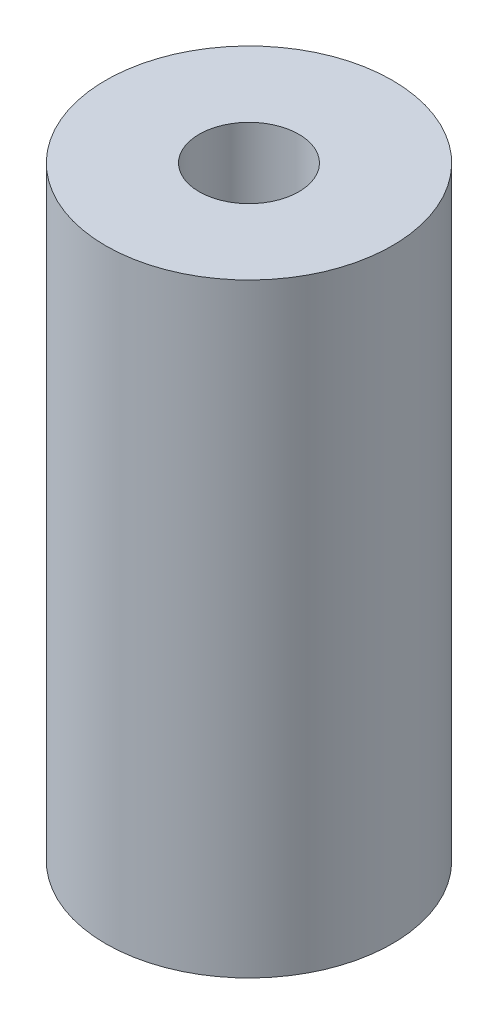
ISO-10303-21;
HEADER;
FILE_DESCRIPTION(('STEP AP214'),'2;1');
FILE_NAME('part.step','',(''),(''),'','','');
FILE_SCHEMA(('AUTOMOTIVE_DESIGN { 1 0 10303 214 1 1 1 1 }'));
ENDSEC;
DATA;
#1=APPLICATION_CONTEXT('core data for automotive mechanical design processes');
#2=APPLICATION_PROTOCOL_DEFINITION('international standard','automotive_design',2000,#1);
#3=PRODUCT_CONTEXT('',#1,'mechanical');
#4=PRODUCT('Part','Part','',(#3));
#5=PRODUCT_RELATED_PRODUCT_CATEGORY('part','',(#4));
#6=PRODUCT_DEFINITION_FORMATION('','',#4);
#7=PRODUCT_DEFINITION_CONTEXT('part definition',#1,'design');
#8=PRODUCT_DEFINITION('design','',#6,#7);
#9=PRODUCT_DEFINITION_SHAPE('','',#8);
#10=(LENGTH_UNIT() NAMED_UNIT(*) SI_UNIT(.MILLI.,.METRE.));
#11=(NAMED_UNIT(*) PLANE_ANGLE_UNIT() SI_UNIT($,.RADIAN.));
#12=(NAMED_UNIT(*) SI_UNIT($,.STERADIAN.) SOLID_ANGLE_UNIT());
#13=UNCERTAINTY_MEASURE_WITH_UNIT(LENGTH_MEASURE(1.E-05),#10,'distance_accuracy_value','');
#14=(GEOMETRIC_REPRESENTATION_CONTEXT(3) GLOBAL_UNCERTAINTY_ASSIGNED_CONTEXT((#13)) GLOBAL_UNIT_ASSIGNED_CONTEXT((#10,
#11,#12)) REPRESENTATION_CONTEXT('',''));
#15=CARTESIAN_POINT('',(0.,0.,0.));
#16=DIRECTION('',(0.,0.,1.));
#17=DIRECTION('',(1.,0.,0.));
#18=AXIS2_PLACEMENT_3D('',#15,#16,#17);
#19=CARTESIAN_POINT('',(0.,19.4,0.));
#20=DIRECTION('',(0.,1.,0.));
#21=DIRECTION('',(0.,0.,1.));
#22=AXIS2_PLACEMENT_3D('',#19,#20,#21);
#23=PLANE('',#22);
#24=CARTESIAN_POINT('',(0.,19.4,0.));
#25=DIRECTION('',(0.,1.,0.));
#26=DIRECTION('',(0.,0.,1.));
#27=AXIS2_PLACEMENT_3D('',#24,#25,#26);
#28=CIRCLE('',#27,4.6);
#29=CARTESIAN_POINT('',(0.,19.4,4.6));
#30=VERTEX_POINT('',#29);
#31=EDGE_CURVE('E10',#30,#30,#28,.T.);
#32=ORIENTED_EDGE('',*,*,#31,.T.);
#33=EDGE_LOOP('',(#32));
#34=FACE_BOUND('',#33,.T.);
#35=CARTESIAN_POINT('',(0.,19.4,0.));
#36=DIRECTION('',(0.,1.,0.));
#37=DIRECTION('',(0.,0.,1.));
#38=AXIS2_PLACEMENT_3D('',#35,#36,#37);
#39=CIRCLE('',#38,1.6);
#40=CARTESIAN_POINT('',(0.,19.4,1.6));
#41=VERTEX_POINT('',#40);
#42=EDGE_CURVE('E46',#41,#41,#39,.T.);
#43=ORIENTED_EDGE('',*,*,#42,.F.);
#44=EDGE_LOOP('',(#43));
#45=FACE_BOUND('',#44,.T.);
#46=ADVANCED_FACE('F35',(#34,#45),#23,.T.);
#47=CARTESIAN_POINT('',(0.,0.,0.));
#48=DIRECTION('',(0.,1.,0.));
#49=DIRECTION('',(0.,0.,1.));
#50=AXIS2_PLACEMENT_3D('',#47,#48,#49);
#51=PLANE('',#50);
#52=CARTESIAN_POINT('',(0.,0.,0.));
#53=DIRECTION('',(0.,1.,0.));
#54=DIRECTION('',(0.,0.,1.));
#55=AXIS2_PLACEMENT_3D('',#52,#53,#54);
#56=CIRCLE('',#55,4.6);
#57=CARTESIAN_POINT('',(0.,0.,4.6));
#58=VERTEX_POINT('',#57);
#59=EDGE_CURVE('E39',#58,#58,#56,.T.);
#60=ORIENTED_EDGE('',*,*,#59,.F.);
#61=EDGE_LOOP('',(#60));
#62=FACE_BOUND('',#61,.T.);
#63=CARTESIAN_POINT('',(0.,0.,0.));
#64=DIRECTION('',(0.,1.,0.));
#65=DIRECTION('',(0.,0.,1.));
#66=AXIS2_PLACEMENT_3D('',#63,#64,#65);
#67=CIRCLE('',#66,1.6);
#68=CARTESIAN_POINT('',(0.,0.,1.6));
#69=VERTEX_POINT('',#68);
#70=EDGE_CURVE('E48',#69,#69,#67,.T.);
#71=ORIENTED_EDGE('',*,*,#70,.T.);
#72=EDGE_LOOP('',(#71));
#73=FACE_BOUND('',#72,.T.);
#74=ADVANCED_FACE('F58',(#62,#73),#51,.F.);
#75=CARTESIAN_POINT('',(0.,19.4,0.));
#76=DIRECTION('',(0.,-1.,0.));
#77=DIRECTION('',(0.,0.,-1.));
#78=AXIS2_PLACEMENT_3D('',#75,#76,#77);
#79=CYLINDRICAL_SURFACE('',#78,4.6);
#80=ORIENTED_EDGE('',*,*,#31,.F.);
#81=EDGE_LOOP('',(#80));
#82=FACE_BOUND('',#81,.T.);
#83=ORIENTED_EDGE('',*,*,#59,.T.);
#84=EDGE_LOOP('',(#83));
#85=FACE_BOUND('',#84,.T.);
#86=ADVANCED_FACE('F37',(#82,#85),#79,.T.);
#87=CARTESIAN_POINT('',(0.,19.4,0.));
#88=DIRECTION('',(0.,-1.,0.));
#89=DIRECTION('',(0.,0.,-1.));
#90=AXIS2_PLACEMENT_3D('',#87,#88,#89);
#91=CYLINDRICAL_SURFACE('',#90,1.6);
#92=ORIENTED_EDGE('',*,*,#42,.T.);
#93=EDGE_LOOP('',(#92));
#94=FACE_BOUND('',#93,.T.);
#95=ORIENTED_EDGE('',*,*,#70,.F.);
#96=EDGE_LOOP('',(#95));
#97=FACE_BOUND('',#96,.T.);
#98=ADVANCED_FACE('F54',(#94,#97),#91,.F.);
#99=CLOSED_SHELL('',(#46,#74,#86,#98));
#100=MANIFOLD_SOLID_BREP('B2',#99);
#101=ADVANCED_BREP_SHAPE_REPRESENTATION('',(#18,#100),#14);
#102=SHAPE_DEFINITION_REPRESENTATION(#9,#101);
ENDSEC;
END-ISO-10303-21;
